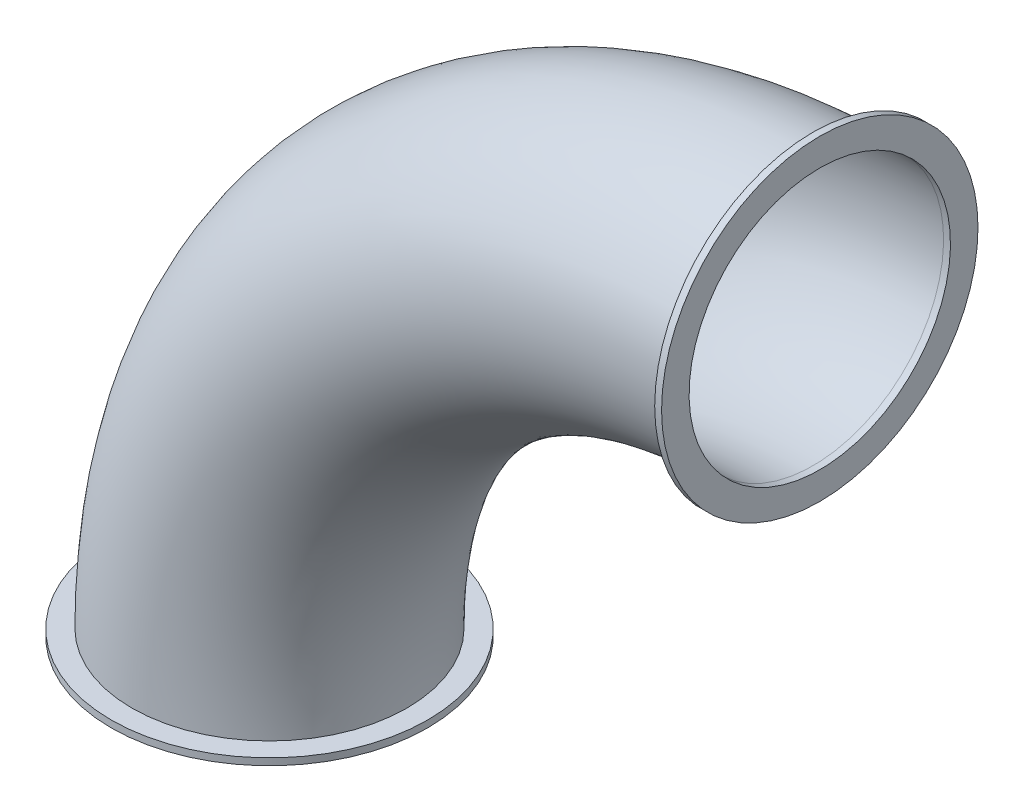
ISO-10303-21;
HEADER;
FILE_DESCRIPTION(('STEP AP214'),'2;1');
FILE_NAME('part.step','',(''),(''),'','','');
FILE_SCHEMA(('AUTOMOTIVE_DESIGN { 1 0 10303 214 1 1 1 1 }'));
ENDSEC;
DATA;
#1=APPLICATION_CONTEXT('core data for automotive mechanical design processes');
#2=APPLICATION_PROTOCOL_DEFINITION('international standard','automotive_design',2000,#1);
#3=PRODUCT_CONTEXT('',#1,'mechanical');
#4=PRODUCT('Part','Part','',(#3));
#5=PRODUCT_RELATED_PRODUCT_CATEGORY('part','',(#4));
#6=PRODUCT_DEFINITION_FORMATION('','',#4);
#7=PRODUCT_DEFINITION_CONTEXT('part definition',#1,'design');
#8=PRODUCT_DEFINITION('design','',#6,#7);
#9=PRODUCT_DEFINITION_SHAPE('','',#8);
#10=(LENGTH_UNIT() NAMED_UNIT(*) SI_UNIT(.MILLI.,.METRE.));
#11=(NAMED_UNIT(*) PLANE_ANGLE_UNIT() SI_UNIT($,.RADIAN.));
#12=(NAMED_UNIT(*) SI_UNIT($,.STERADIAN.) SOLID_ANGLE_UNIT());
#13=UNCERTAINTY_MEASURE_WITH_UNIT(LENGTH_MEASURE(1.E-05),#10,'distance_accuracy_value','');
#14=(GEOMETRIC_REPRESENTATION_CONTEXT(3) GLOBAL_UNCERTAINTY_ASSIGNED_CONTEXT((#13)) GLOBAL_UNIT_ASSIGNED_CONTEXT((#10,
#11,#12)) REPRESENTATION_CONTEXT('',''));
#15=CARTESIAN_POINT('',(0.,0.,0.));
#16=DIRECTION('',(0.,0.,1.));
#17=DIRECTION('',(1.,0.,0.));
#18=AXIS2_PLACEMENT_3D('',#15,#16,#17);
#19=CARTESIAN_POINT('',(-2.,2.,0.));
#20=DIRECTION('',(0.,0.,-1.));
#21=DIRECTION('',(-1.,0.,0.));
#22=AXIS2_PLACEMENT_3D('',#19,#20,#21);
#23=TOROIDAL_SURFACE('',#22,158.,40.);
#24=CARTESIAN_POINT('',(-160.,2.,0.));
#25=DIRECTION('',(0.,-1.,0.));
#26=DIRECTION('',(1.,0.,0.));
#27=AXIS2_PLACEMENT_3D('',#24,#25,#26);
#28=CIRCLE('',#27,40.);
#29=CARTESIAN_POINT('',(-200.,2.,0.));
#30=VERTEX_POINT('',#29);
#31=EDGE_CURVE('E99',#30,#30,#28,.T.);
#32=ORIENTED_EDGE('',*,*,#31,.F.);
#33=EDGE_LOOP('',(#32));
#34=FACE_BOUND('',#33,.T.);
#35=CARTESIAN_POINT('',(-2.,160.,0.));
#36=DIRECTION('',(-1.,0.,0.));
#37=DIRECTION('',(0.,-1.,0.));
#38=AXIS2_PLACEMENT_3D('',#35,#36,#37);
#39=CIRCLE('',#38,40.);
#40=CARTESIAN_POINT('',(-2.,200.,0.));
#41=VERTEX_POINT('',#40);
#42=EDGE_CURVE('E78',#41,#41,#39,.T.);
#43=ORIENTED_EDGE('',*,*,#42,.T.);
#44=EDGE_LOOP('',(#43));
#45=FACE_BOUND('',#44,.T.);
#46=ADVANCED_FACE('F18',(#34,#45),#23,.T.);
#47=CARTESIAN_POINT('',(-2.,2.,0.));
#48=DIRECTION('',(0.,0.,-1.));
#49=DIRECTION('',(-1.,0.,0.));
#50=AXIS2_PLACEMENT_3D('',#47,#48,#49);
#51=TOROIDAL_SURFACE('',#50,158.,38.);
#52=CARTESIAN_POINT('',(-160.,2.,0.));
#53=DIRECTION('',(0.,1.,0.));
#54=DIRECTION('',(-1.,0.,0.));
#55=AXIS2_PLACEMENT_3D('',#52,#53,#54);
#56=CIRCLE('',#55,38.);
#57=CARTESIAN_POINT('',(-198.,2.,0.));
#58=VERTEX_POINT('',#57);
#59=EDGE_CURVE('E61',#58,#58,#56,.T.);
#60=ORIENTED_EDGE('',*,*,#59,.F.);
#61=EDGE_LOOP('',(#60));
#62=FACE_BOUND('',#61,.T.);
#63=CARTESIAN_POINT('',(-2.,160.,0.));
#64=DIRECTION('',(-1.,0.,0.));
#65=DIRECTION('',(0.,1.,0.));
#66=AXIS2_PLACEMENT_3D('',#63,#64,#65);
#67=CIRCLE('',#66,38.);
#68=CARTESIAN_POINT('',(-2.,198.,0.));
#69=VERTEX_POINT('',#68);
#70=EDGE_CURVE('E21',#69,#69,#67,.T.);
#71=ORIENTED_EDGE('',*,*,#70,.F.);
#72=EDGE_LOOP('',(#71));
#73=FACE_BOUND('',#72,.T.);
#74=ADVANCED_FACE('F123',(#62,#73),#51,.F.);
#75=CARTESIAN_POINT('',(0.,160.,0.));
#76=DIRECTION('',(-1.,0.,0.));
#77=DIRECTION('',(0.,0.,1.));
#78=AXIS2_PLACEMENT_3D('',#75,#76,#77);
#79=PLANE('',#78);
#80=CARTESIAN_POINT('',(0.,160.,0.));
#81=DIRECTION('',(-1.,0.,0.));
#82=DIRECTION('',(0.,-1.,0.));
#83=AXIS2_PLACEMENT_3D('',#80,#81,#82);
#84=CIRCLE('',#83,38.);
#85=CARTESIAN_POINT('',(0.,198.,0.));
#86=VERTEX_POINT('',#85);
#87=EDGE_CURVE('E83',#86,#86,#84,.T.);
#88=ORIENTED_EDGE('',*,*,#87,.T.);
#89=EDGE_LOOP('',(#88));
#90=FACE_BOUND('',#89,.T.);
#91=CARTESIAN_POINT('',(0.,160.,0.));
#92=DIRECTION('',(-1.,0.,0.));
#93=DIRECTION('',(0.,-1.,0.));
#94=AXIS2_PLACEMENT_3D('',#91,#92,#93);
#95=CIRCLE('',#94,46.);
#96=CARTESIAN_POINT('',(0.,206.,0.));
#97=VERTEX_POINT('',#96);
#98=EDGE_CURVE('E10',#97,#97,#95,.T.);
#99=ORIENTED_EDGE('',*,*,#98,.F.);
#100=EDGE_LOOP('',(#99));
#101=FACE_BOUND('',#100,.T.);
#102=ADVANCED_FACE('F84',(#90,#101),#79,.F.);
#103=CARTESIAN_POINT('',(-2.,160.,0.));
#104=DIRECTION('',(1.,0.,0.));
#105=DIRECTION('',(0.,-1.,0.));
#106=AXIS2_PLACEMENT_3D('',#103,#104,#105);
#107=CYLINDRICAL_SURFACE('',#106,46.);
#108=CARTESIAN_POINT('',(-2.,160.,0.));
#109=DIRECTION('',(-1.,0.,0.));
#110=DIRECTION('',(0.,-1.,0.));
#111=AXIS2_PLACEMENT_3D('',#108,#109,#110);
#112=CIRCLE('',#111,46.);
#113=CARTESIAN_POINT('',(-2.,206.,0.));
#114=VERTEX_POINT('',#113);
#115=EDGE_CURVE('E94',#114,#114,#112,.T.);
#116=ORIENTED_EDGE('',*,*,#115,.F.);
#117=EDGE_LOOP('',(#116));
#118=FACE_BOUND('',#117,.T.);
#119=ORIENTED_EDGE('',*,*,#98,.T.);
#120=EDGE_LOOP('',(#119));
#121=FACE_BOUND('',#120,.T.);
#122=ADVANCED_FACE('F112',(#118,#121),#107,.T.);
#123=CARTESIAN_POINT('',(-2.,160.,0.));
#124=DIRECTION('',(1.,0.,0.));
#125=DIRECTION('',(0.,-1.,0.));
#126=AXIS2_PLACEMENT_3D('',#123,#124,#125);
#127=CYLINDRICAL_SURFACE('',#126,38.);
#128=ORIENTED_EDGE('',*,*,#70,.T.);
#129=EDGE_LOOP('',(#128));
#130=FACE_BOUND('',#129,.T.);
#131=ORIENTED_EDGE('',*,*,#87,.F.);
#132=EDGE_LOOP('',(#131));
#133=FACE_BOUND('',#132,.T.);
#134=ADVANCED_FACE('F114',(#130,#133),#127,.F.);
#135=CARTESIAN_POINT('',(-2.,160.,0.));
#136=DIRECTION('',(-1.,0.,0.));
#137=DIRECTION('',(0.,0.,1.));
#138=AXIS2_PLACEMENT_3D('',#135,#136,#137);
#139=PLANE('',#138);
#140=ORIENTED_EDGE('',*,*,#42,.F.);
#141=EDGE_LOOP('',(#140));
#142=FACE_BOUND('',#141,.T.);
#143=ORIENTED_EDGE('',*,*,#115,.T.);
#144=EDGE_LOOP('',(#143));
#145=FACE_BOUND('',#144,.T.);
#146=ADVANCED_FACE('F110',(#142,#145),#139,.T.);
#147=CARTESIAN_POINT('',(-160.,0.,0.));
#148=DIRECTION('',(0.,-1.,0.));
#149=DIRECTION('',(0.,0.,-1.));
#150=AXIS2_PLACEMENT_3D('',#147,#148,#149);
#151=PLANE('',#150);
#152=CARTESIAN_POINT('',(-160.,0.,0.));
#153=DIRECTION('',(0.,1.,0.));
#154=DIRECTION('',(1.,0.,0.));
#155=AXIS2_PLACEMENT_3D('',#152,#153,#154);
#156=CIRCLE('',#155,38.);
#157=CARTESIAN_POINT('',(-198.,0.,0.));
#158=VERTEX_POINT('',#157);
#159=EDGE_CURVE('E71',#158,#158,#156,.T.);
#160=ORIENTED_EDGE('',*,*,#159,.T.);
#161=EDGE_LOOP('',(#160));
#162=FACE_BOUND('',#161,.T.);
#163=CARTESIAN_POINT('',(-160.,0.,0.));
#164=DIRECTION('',(0.,1.,0.));
#165=DIRECTION('',(1.,0.,0.));
#166=AXIS2_PLACEMENT_3D('',#163,#164,#165);
#167=CIRCLE('',#166,46.);
#168=CARTESIAN_POINT('',(-206.,0.,0.));
#169=VERTEX_POINT('',#168);
#170=EDGE_CURVE('E103',#169,#169,#167,.T.);
#171=ORIENTED_EDGE('',*,*,#170,.F.);
#172=EDGE_LOOP('',(#171));
#173=FACE_BOUND('',#172,.T.);
#174=ADVANCED_FACE('F173',(#162,#173),#151,.T.);
#175=CARTESIAN_POINT('',(-160.,2.,0.));
#176=DIRECTION('',(0.,-1.,0.));
#177=DIRECTION('',(1.,0.,0.));
#178=AXIS2_PLACEMENT_3D('',#175,#176,#177);
#179=CYLINDRICAL_SURFACE('',#178,46.);
#180=CARTESIAN_POINT('',(-160.,2.,0.));
#181=DIRECTION('',(0.,-1.,0.));
#182=DIRECTION('',(1.,0.,0.));
#183=AXIS2_PLACEMENT_3D('',#180,#181,#182);
#184=CIRCLE('',#183,46.);
#185=CARTESIAN_POINT('',(-206.,2.,0.));
#186=VERTEX_POINT('',#185);
#187=EDGE_CURVE('E102',#186,#186,#184,.T.);
#188=ORIENTED_EDGE('',*,*,#187,.T.);
#189=EDGE_LOOP('',(#188));
#190=FACE_BOUND('',#189,.T.);
#191=ORIENTED_EDGE('',*,*,#170,.T.);
#192=EDGE_LOOP('',(#191));
#193=FACE_BOUND('',#192,.T.);
#194=ADVANCED_FACE('F192',(#190,#193),#179,.T.);
#195=CARTESIAN_POINT('',(-160.,2.,0.));
#196=DIRECTION('',(0.,-1.,0.));
#197=DIRECTION('',(1.,0.,0.));
#198=AXIS2_PLACEMENT_3D('',#195,#196,#197);
#199=CYLINDRICAL_SURFACE('',#198,38.);
#200=ORIENTED_EDGE('',*,*,#59,.T.);
#201=EDGE_LOOP('',(#200));
#202=FACE_BOUND('',#201,.T.);
#203=ORIENTED_EDGE('',*,*,#159,.F.);
#204=EDGE_LOOP('',(#203));
#205=FACE_BOUND('',#204,.T.);
#206=ADVANCED_FACE('F138',(#202,#205),#199,.F.);
#207=CARTESIAN_POINT('',(-160.,2.,0.));
#208=DIRECTION('',(0.,-1.,0.));
#209=DIRECTION('',(0.,0.,-1.));
#210=AXIS2_PLACEMENT_3D('',#207,#208,#209);
#211=PLANE('',#210);
#212=ORIENTED_EDGE('',*,*,#31,.T.);
#213=EDGE_LOOP('',(#212));
#214=FACE_BOUND('',#213,.T.);
#215=ORIENTED_EDGE('',*,*,#187,.F.);
#216=EDGE_LOOP('',(#215));
#217=FACE_BOUND('',#216,.T.);
#218=ADVANCED_FACE('F135',(#214,#217),#211,.F.);
#219=CLOSED_SHELL('',(#46,#74,#102,#122,#134,#146,#174,#194,#206,#218));
#220=MANIFOLD_SOLID_BREP('B1',#219);
#221=ADVANCED_BREP_SHAPE_REPRESENTATION('',(#18,#220),#14);
#222=SHAPE_DEFINITION_REPRESENTATION(#9,#221);
ENDSEC;
END-ISO-10303-21;
